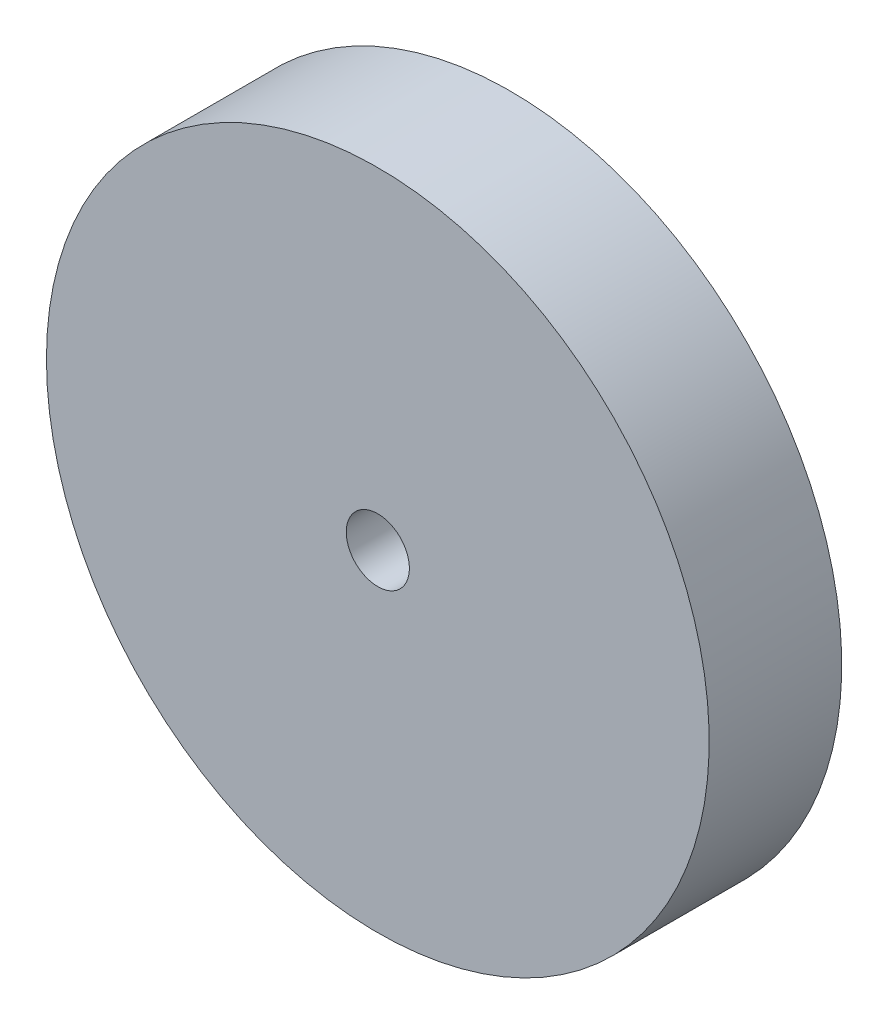
ISO-10303-21;
HEADER;
FILE_DESCRIPTION(('STEP AP214'),'2;1');
FILE_NAME('part.step','',(''),(''),'','','');
FILE_SCHEMA(('AUTOMOTIVE_DESIGN { 1 0 10303 214 1 1 1 1 }'));
ENDSEC;
DATA;
#1=APPLICATION_CONTEXT('core data for automotive mechanical design processes');
#2=APPLICATION_PROTOCOL_DEFINITION('international standard','automotive_design',2000,#1);
#3=PRODUCT_CONTEXT('',#1,'mechanical');
#4=PRODUCT('Part','Part','',(#3));
#5=PRODUCT_RELATED_PRODUCT_CATEGORY('part','',(#4));
#6=PRODUCT_DEFINITION_FORMATION('','',#4);
#7=PRODUCT_DEFINITION_CONTEXT('part definition',#1,'design');
#8=PRODUCT_DEFINITION('design','',#6,#7);
#9=PRODUCT_DEFINITION_SHAPE('','',#8);
#10=(LENGTH_UNIT() NAMED_UNIT(*) SI_UNIT(.MILLI.,.METRE.));
#11=(NAMED_UNIT(*) PLANE_ANGLE_UNIT() SI_UNIT($,.RADIAN.));
#12=(NAMED_UNIT(*) SI_UNIT($,.STERADIAN.) SOLID_ANGLE_UNIT());
#13=UNCERTAINTY_MEASURE_WITH_UNIT(LENGTH_MEASURE(1.E-05),#10,'distance_accuracy_value','');
#14=(GEOMETRIC_REPRESENTATION_CONTEXT(3) GLOBAL_UNCERTAINTY_ASSIGNED_CONTEXT((#13)) GLOBAL_UNIT_ASSIGNED_CONTEXT((#10,
#11,#12)) REPRESENTATION_CONTEXT('',''));
#15=CARTESIAN_POINT('',(0.,0.,0.));
#16=DIRECTION('',(0.,0.,1.));
#17=DIRECTION('',(1.,0.,0.));
#18=AXIS2_PLACEMENT_3D('',#15,#16,#17);
#19=CARTESIAN_POINT('',(0.,0.,21.));
#20=DIRECTION('',(0.,0.,1.));
#21=DIRECTION('',(1.,0.,0.));
#22=AXIS2_PLACEMENT_3D('',#19,#20,#21);
#23=PLANE('',#22);
#24=CARTESIAN_POINT('',(0.,0.,21.));
#25=DIRECTION('',(0.,0.,1.));
#26=DIRECTION('',(1.,0.,0.));
#27=AXIS2_PLACEMENT_3D('',#24,#25,#26);
#28=CIRCLE('',#27,52.5);
#29=CARTESIAN_POINT('',(-52.5,0.,21.));
#30=VERTEX_POINT('',#29);
#31=EDGE_CURVE('E10',#30,#30,#28,.T.);
#32=ORIENTED_EDGE('',*,*,#31,.T.);
#33=EDGE_LOOP('',(#32));
#34=FACE_BOUND('',#33,.T.);
#35=CARTESIAN_POINT('',(0.,0.,21.));
#36=DIRECTION('',(0.,0.,1.));
#37=DIRECTION('',(1.,0.,0.));
#38=AXIS2_PLACEMENT_3D('',#35,#36,#37);
#39=CIRCLE('',#38,5.);
#40=CARTESIAN_POINT('',(-5.,0.,21.));
#41=VERTEX_POINT('',#40);
#42=EDGE_CURVE('E52',#41,#41,#39,.T.);
#43=ORIENTED_EDGE('',*,*,#42,.F.);
#44=EDGE_LOOP('',(#43));
#45=FACE_BOUND('',#44,.T.);
#46=ADVANCED_FACE('F41',(#34,#45),#23,.T.);
#47=CARTESIAN_POINT('',(0.,0.,0.));
#48=DIRECTION('',(0.,0.,1.));
#49=DIRECTION('',(1.,0.,0.));
#50=AXIS2_PLACEMENT_3D('',#47,#48,#49);
#51=PLANE('',#50);
#52=CARTESIAN_POINT('',(0.,0.,0.));
#53=DIRECTION('',(0.,0.,1.));
#54=DIRECTION('',(1.,0.,0.));
#55=AXIS2_PLACEMENT_3D('',#52,#53,#54);
#56=CIRCLE('',#55,52.5);
#57=CARTESIAN_POINT('',(-52.5,0.,0.));
#58=VERTEX_POINT('',#57);
#59=EDGE_CURVE('E45',#58,#58,#56,.T.);
#60=ORIENTED_EDGE('',*,*,#59,.F.);
#61=EDGE_LOOP('',(#60));
#62=FACE_BOUND('',#61,.T.);
#63=CARTESIAN_POINT('',(0.,0.,0.));
#64=DIRECTION('',(0.,0.,1.));
#65=DIRECTION('',(1.,0.,0.));
#66=AXIS2_PLACEMENT_3D('',#63,#64,#65);
#67=CIRCLE('',#66,5.);
#68=CARTESIAN_POINT('',(-5.,0.,0.));
#69=VERTEX_POINT('',#68);
#70=EDGE_CURVE('E54',#69,#69,#67,.T.);
#71=ORIENTED_EDGE('',*,*,#70,.T.);
#72=EDGE_LOOP('',(#71));
#73=FACE_BOUND('',#72,.T.);
#74=ADVANCED_FACE('F64',(#62,#73),#51,.F.);
#75=CARTESIAN_POINT('',(0.,0.,21.));
#76=DIRECTION('',(0.,0.,-1.));
#77=DIRECTION('',(-1.,0.,0.));
#78=AXIS2_PLACEMENT_3D('',#75,#76,#77);
#79=CYLINDRICAL_SURFACE('',#78,52.5);
#80=CARTESIAN_POINT('',(-52.5,0.,21.));
#81=CARTESIAN_POINT('',(-52.5,0.,20.78125));
#82=CARTESIAN_POINT('',(-52.5,0.,20.5625));
#83=CARTESIAN_POINT('',(-52.5,0.,20.125));
#84=CARTESIAN_POINT('',(-52.5,0.,19.90625));
#85=CARTESIAN_POINT('',(-52.5,0.,19.46875));
#86=CARTESIAN_POINT('',(-52.5,0.,19.25));
#87=CARTESIAN_POINT('',(-52.5,0.,18.8125));
#88=CARTESIAN_POINT('',(-52.5,0.,18.59375));
#89=CARTESIAN_POINT('',(-52.5,0.,18.15625));
#90=CARTESIAN_POINT('',(-52.5,0.,17.9375));
#91=CARTESIAN_POINT('',(-52.5,0.,17.5));
#92=CARTESIAN_POINT('',(-52.5,0.,17.28125));
#93=CARTESIAN_POINT('',(-52.5,0.,16.84375));
#94=CARTESIAN_POINT('',(-52.5,0.,16.625));
#95=CARTESIAN_POINT('',(-52.5,0.,16.1875));
#96=CARTESIAN_POINT('',(-52.5,0.,15.96875));
#97=CARTESIAN_POINT('',(-52.5,0.,15.53125));
#98=CARTESIAN_POINT('',(-52.5,0.,15.3125));
#99=CARTESIAN_POINT('',(-52.5,0.,14.875));
#100=CARTESIAN_POINT('',(-52.5,0.,14.65625));
#101=CARTESIAN_POINT('',(-52.5,0.,14.21875));
#102=CARTESIAN_POINT('',(-52.5,0.,14.));
#103=CARTESIAN_POINT('',(-52.5,0.,13.5625));
#104=CARTESIAN_POINT('',(-52.5,0.,13.34375));
#105=CARTESIAN_POINT('',(-52.5,0.,12.90625));
#106=CARTESIAN_POINT('',(-52.5,0.,12.6875));
#107=CARTESIAN_POINT('',(-52.5,0.,12.25));
#108=CARTESIAN_POINT('',(-52.5,0.,12.03125));
#109=CARTESIAN_POINT('',(-52.5,0.,11.59375));
#110=CARTESIAN_POINT('',(-52.5,0.,11.375));
#111=CARTESIAN_POINT('',(-52.5,0.,10.9375));
#112=CARTESIAN_POINT('',(-52.5,0.,10.71875));
#113=CARTESIAN_POINT('',(-52.5,0.,10.28125));
#114=CARTESIAN_POINT('',(-52.5,0.,10.0625));
#115=CARTESIAN_POINT('',(-52.5,0.,9.625));
#116=CARTESIAN_POINT('',(-52.5,0.,9.40625));
#117=CARTESIAN_POINT('',(-52.5,0.,8.96875));
#118=CARTESIAN_POINT('',(-52.5,0.,8.75));
#119=CARTESIAN_POINT('',(-52.5,0.,8.3125));
#120=CARTESIAN_POINT('',(-52.5,0.,8.09375));
#121=CARTESIAN_POINT('',(-52.5,0.,7.65625));
#122=CARTESIAN_POINT('',(-52.5,0.,7.4375));
#123=CARTESIAN_POINT('',(-52.5,0.,7.));
#124=CARTESIAN_POINT('',(-52.5,0.,6.78125));
#125=CARTESIAN_POINT('',(-52.5,0.,6.34375));
#126=CARTESIAN_POINT('',(-52.5,0.,6.125));
#127=CARTESIAN_POINT('',(-52.5,0.,5.6875));
#128=CARTESIAN_POINT('',(-52.5,0.,5.46875));
#129=CARTESIAN_POINT('',(-52.5,0.,5.03125));
#130=CARTESIAN_POINT('',(-52.5,0.,4.8125));
#131=CARTESIAN_POINT('',(-52.5,0.,4.375));
#132=CARTESIAN_POINT('',(-52.5,0.,4.15625));
#133=CARTESIAN_POINT('',(-52.5,0.,3.71875));
#134=CARTESIAN_POINT('',(-52.5,0.,3.5));
#135=CARTESIAN_POINT('',(-52.5,0.,3.0625));
#136=CARTESIAN_POINT('',(-52.5,0.,2.84375));
#137=CARTESIAN_POINT('',(-52.5,0.,2.40625));
#138=CARTESIAN_POINT('',(-52.5,0.,2.1875));
#139=CARTESIAN_POINT('',(-52.5,0.,1.75));
#140=CARTESIAN_POINT('',(-52.5,0.,1.53125));
#141=CARTESIAN_POINT('',(-52.5,0.,1.09375));
#142=CARTESIAN_POINT('',(-52.5,0.,0.875000000000001));
#143=CARTESIAN_POINT('',(-52.5,0.,0.4375));
#144=CARTESIAN_POINT('',(-52.5,0.,0.21875));
#145=CARTESIAN_POINT('',(-52.5,0.,0.));
#146=B_SPLINE_CURVE_WITH_KNOTS('',3,(#80,#81,#82,#83,#84,#85,#86,#87,#88,#89,#90,#91,#92,#93,
#94,#95,#96,#97,#98,#99,#100,#101,#102,#103,#104,#105,#106,#107,#108,#109,#110,#111,#112,#113,
#114,#115,#116,#117,#118,#119,#120,#121,#122,#123,#124,#125,#126,#127,#128,#129,#130,#131,#132,
#133,#134,#135,#136,#137,#138,#139,#140,#141,#142,#143,#144,#145),.UNSPECIFIED.,.F.,.F.,(4,2,2,
2,2,2,2,2,2,2,2,2,2,2,2,2,2,2,2,2,2,2,2,2,2,2,2,2,2,2,2,2,4),(0.,0.656249999999997,1.3125,
1.96875,2.625,3.28125,3.9375,4.59375,5.25,5.90625,6.5625,7.21875,7.875,8.53125,9.1875,9.84375,
10.5,11.15625,11.8125,12.46875,13.125,13.78125,14.4375,15.09375,15.75,16.40625,17.0625,17.71875,
18.375,19.03125,19.6875,20.34375,21.),.UNSPECIFIED.);
#147=EDGE_CURVE('BSEAM43',#30,#58,#146,.T.);
#148=ORIENTED_EDGE('',*,*,#31,.F.);
#149=ORIENTED_EDGE('',*,*,#59,.T.);
#150=ORIENTED_EDGE('',*,*,#147,.T.);
#151=ORIENTED_EDGE('',*,*,#147,.F.);
#152=EDGE_LOOP('',(#148,#150,#149,#151));
#153=FACE_BOUND('',#152,.T.);
#154=ADVANCED_FACE('F43',(#153),#79,.T.);
#155=CARTESIAN_POINT('',(0.,0.,21.));
#156=DIRECTION('',(0.,0.,-1.));
#157=DIRECTION('',(-1.,0.,0.));
#158=AXIS2_PLACEMENT_3D('',#155,#156,#157);
#159=CYLINDRICAL_SURFACE('',#158,5.);
#160=CARTESIAN_POINT('',(-5.,0.,21.));
#161=CARTESIAN_POINT('',(-5.,0.,20.78125));
#162=CARTESIAN_POINT('',(-5.,0.,20.5625));
#163=CARTESIAN_POINT('',(-5.,0.,20.125));
#164=CARTESIAN_POINT('',(-5.,0.,19.90625));
#165=CARTESIAN_POINT('',(-5.,0.,19.46875));
#166=CARTESIAN_POINT('',(-5.,0.,19.25));
#167=CARTESIAN_POINT('',(-5.,0.,18.8125));
#168=CARTESIAN_POINT('',(-5.,0.,18.59375));
#169=CARTESIAN_POINT('',(-5.,0.,18.15625));
#170=CARTESIAN_POINT('',(-5.,0.,17.9375));
#171=CARTESIAN_POINT('',(-5.,0.,17.5));
#172=CARTESIAN_POINT('',(-5.,0.,17.28125));
#173=CARTESIAN_POINT('',(-5.,0.,16.84375));
#174=CARTESIAN_POINT('',(-5.,0.,16.625));
#175=CARTESIAN_POINT('',(-5.,0.,16.1875));
#176=CARTESIAN_POINT('',(-5.,0.,15.96875));
#177=CARTESIAN_POINT('',(-5.,0.,15.53125));
#178=CARTESIAN_POINT('',(-5.,0.,15.3125));
#179=CARTESIAN_POINT('',(-5.,0.,14.875));
#180=CARTESIAN_POINT('',(-5.,0.,14.65625));
#181=CARTESIAN_POINT('',(-5.,0.,14.21875));
#182=CARTESIAN_POINT('',(-5.,0.,14.));
#183=CARTESIAN_POINT('',(-5.,0.,13.5625));
#184=CARTESIAN_POINT('',(-5.,0.,13.34375));
#185=CARTESIAN_POINT('',(-5.,0.,12.90625));
#186=CARTESIAN_POINT('',(-5.,0.,12.6875));
#187=CARTESIAN_POINT('',(-5.,0.,12.25));
#188=CARTESIAN_POINT('',(-5.,0.,12.03125));
#189=CARTESIAN_POINT('',(-5.,0.,11.59375));
#190=CARTESIAN_POINT('',(-5.,0.,11.375));
#191=CARTESIAN_POINT('',(-5.,0.,10.9375));
#192=CARTESIAN_POINT('',(-5.,0.,10.71875));
#193=CARTESIAN_POINT('',(-5.,0.,10.28125));
#194=CARTESIAN_POINT('',(-5.,0.,10.0625));
#195=CARTESIAN_POINT('',(-5.,0.,9.625));
#196=CARTESIAN_POINT('',(-5.,0.,9.40625));
#197=CARTESIAN_POINT('',(-5.,0.,8.96875));
#198=CARTESIAN_POINT('',(-5.,0.,8.75));
#199=CARTESIAN_POINT('',(-5.,0.,8.3125));
#200=CARTESIAN_POINT('',(-5.,0.,8.09375));
#201=CARTESIAN_POINT('',(-5.,0.,7.65625));
#202=CARTESIAN_POINT('',(-5.,0.,7.4375));
#203=CARTESIAN_POINT('',(-5.,0.,7.));
#204=CARTESIAN_POINT('',(-5.,0.,6.78125));
#205=CARTESIAN_POINT('',(-5.,0.,6.34375));
#206=CARTESIAN_POINT('',(-5.,0.,6.125));
#207=CARTESIAN_POINT('',(-5.,0.,5.6875));
#208=CARTESIAN_POINT('',(-5.,0.,5.46875));
#209=CARTESIAN_POINT('',(-5.,0.,5.03125));
#210=CARTESIAN_POINT('',(-5.,0.,4.8125));
#211=CARTESIAN_POINT('',(-5.,0.,4.375));
#212=CARTESIAN_POINT('',(-5.,0.,4.15625));
#213=CARTESIAN_POINT('',(-5.,0.,3.71875));
#214=CARTESIAN_POINT('',(-5.,0.,3.5));
#215=CARTESIAN_POINT('',(-5.,0.,3.0625));
#216=CARTESIAN_POINT('',(-5.,0.,2.84375));
#217=CARTESIAN_POINT('',(-5.,0.,2.40625));
#218=CARTESIAN_POINT('',(-5.,0.,2.1875));
#219=CARTESIAN_POINT('',(-5.,0.,1.75));
#220=CARTESIAN_POINT('',(-5.,0.,1.53125));
#221=CARTESIAN_POINT('',(-5.,0.,1.09375));
#222=CARTESIAN_POINT('',(-5.,0.,0.875000000000001));
#223=CARTESIAN_POINT('',(-5.,0.,0.4375));
#224=CARTESIAN_POINT('',(-5.,0.,0.21875));
#225=CARTESIAN_POINT('',(-5.,0.,0.));
#226=B_SPLINE_CURVE_WITH_KNOTS('',3,(#160,#161,#162,#163,#164,#165,#166,#167,#168,#169,#170,
#171,#172,#173,#174,#175,#176,#177,#178,#179,#180,#181,#182,#183,#184,#185,#186,#187,#188,#189,
#190,#191,#192,#193,#194,#195,#196,#197,#198,#199,#200,#201,#202,#203,#204,#205,#206,#207,#208,
#209,#210,#211,#212,#213,#214,#215,#216,#217,#218,#219,#220,#221,#222,#223,#224,#225),
.UNSPECIFIED.,.F.,.F.,(4,2,2,2,2,2,2,2,2,2,2,2,2,2,2,2,2,2,2,2,2,2,2,2,2,2,2,2,2,2,2,2,4),(0.,
0.656250000000001,1.3125,1.96875,2.625,3.28125,3.9375,4.59375,5.25,5.90625,6.5625,7.21875,7.875,
8.53125,9.1875,9.84375,10.5,11.15625,11.8125,12.46875,13.125,13.78125,14.4375,15.09375,15.75,
16.40625,17.0625,17.71875,18.375,19.03125,19.6875,20.34375,21.),.UNSPECIFIED.);
#227=EDGE_CURVE('BSEAM60',#41,#69,#226,.T.);
#228=ORIENTED_EDGE('',*,*,#42,.T.);
#229=ORIENTED_EDGE('',*,*,#70,.F.);
#230=ORIENTED_EDGE('',*,*,#227,.T.);
#231=ORIENTED_EDGE('',*,*,#227,.F.);
#232=EDGE_LOOP('',(#228,#230,#229,#231));
#233=FACE_BOUND('',#232,.T.);
#234=ADVANCED_FACE('F60',(#233),#159,.F.);
#235=CLOSED_SHELL('',(#46,#74,#154,#234));
#236=MANIFOLD_SOLID_BREP('B2',#235);
#237=ADVANCED_BREP_SHAPE_REPRESENTATION('',(#18,#236),#14);
#238=SHAPE_DEFINITION_REPRESENTATION(#9,#237);
ENDSEC;
END-ISO-10303-21;
